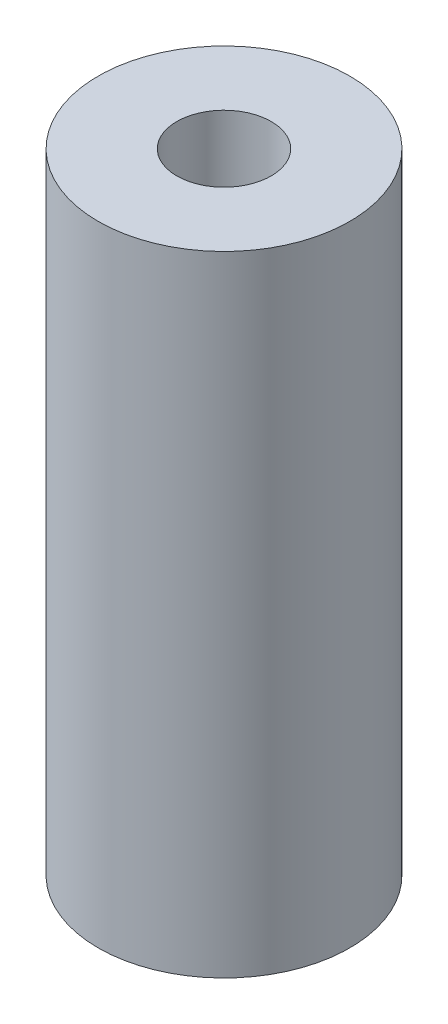
ISO-10303-21;
HEADER;
FILE_DESCRIPTION(('STEP AP214'),'2;1');
FILE_NAME('part.step','',(''),(''),'','','');
FILE_SCHEMA(('AUTOMOTIVE_DESIGN { 1 0 10303 214 1 1 1 1 }'));
ENDSEC;
DATA;
#1=APPLICATION_CONTEXT('core data for automotive mechanical design processes');
#2=APPLICATION_PROTOCOL_DEFINITION('international standard','automotive_design',2000,#1);
#3=PRODUCT_CONTEXT('',#1,'mechanical');
#4=PRODUCT('Part','Part','',(#3));
#5=PRODUCT_RELATED_PRODUCT_CATEGORY('part','',(#4));
#6=PRODUCT_DEFINITION_FORMATION('','',#4);
#7=PRODUCT_DEFINITION_CONTEXT('part definition',#1,'design');
#8=PRODUCT_DEFINITION('design','',#6,#7);
#9=PRODUCT_DEFINITION_SHAPE('','',#8);
#10=(LENGTH_UNIT() NAMED_UNIT(*) SI_UNIT(.MILLI.,.METRE.));
#11=(NAMED_UNIT(*) PLANE_ANGLE_UNIT() SI_UNIT($,.RADIAN.));
#12=(NAMED_UNIT(*) SI_UNIT($,.STERADIAN.) SOLID_ANGLE_UNIT());
#13=UNCERTAINTY_MEASURE_WITH_UNIT(LENGTH_MEASURE(1.E-05),#10,'distance_accuracy_value','');
#14=(GEOMETRIC_REPRESENTATION_CONTEXT(3) GLOBAL_UNCERTAINTY_ASSIGNED_CONTEXT((#13)) GLOBAL_UNIT_ASSIGNED_CONTEXT((#10,
#11,#12)) REPRESENTATION_CONTEXT('',''));
#15=CARTESIAN_POINT('',(0.,0.,0.));
#16=DIRECTION('',(0.,0.,1.));
#17=DIRECTION('',(1.,0.,0.));
#18=AXIS2_PLACEMENT_3D('',#15,#16,#17);
#19=CARTESIAN_POINT('',(0.,20.,0.));
#20=DIRECTION('',(0.,-1.,0.));
#21=DIRECTION('',(0.,0.,-1.));
#22=AXIS2_PLACEMENT_3D('',#19,#20,#21);
#23=CYLINDRICAL_SURFACE('',#22,4.);
#24=CARTESIAN_POINT('',(0.,20.,0.));
#25=DIRECTION('',(0.,1.,0.));
#26=DIRECTION('',(0.,0.,1.));
#27=AXIS2_PLACEMENT_3D('',#24,#25,#26);
#28=CIRCLE('',#27,4.);
#29=CARTESIAN_POINT('',(0.,20.,4.));
#30=VERTEX_POINT('',#29);
#31=EDGE_CURVE('E10',#30,#30,#28,.T.);
#32=ORIENTED_EDGE('',*,*,#31,.F.);
#33=EDGE_LOOP('',(#32));
#34=FACE_BOUND('',#33,.T.);
#35=CARTESIAN_POINT('',(0.,0.,0.));
#36=DIRECTION('',(0.,1.,0.));
#37=DIRECTION('',(0.,0.,1.));
#38=AXIS2_PLACEMENT_3D('',#35,#36,#37);
#39=CIRCLE('',#38,4.);
#40=CARTESIAN_POINT('',(0.,0.,4.));
#41=VERTEX_POINT('',#40);
#42=EDGE_CURVE('E46',#41,#41,#39,.T.);
#43=ORIENTED_EDGE('',*,*,#42,.T.);
#44=EDGE_LOOP('',(#43));
#45=FACE_BOUND('',#44,.T.);
#46=ADVANCED_FACE('F43',(#34,#45),#23,.T.);
#47=CARTESIAN_POINT('',(0.,20.,0.));
#48=DIRECTION('',(0.,1.,0.));
#49=DIRECTION('',(0.,0.,1.));
#50=AXIS2_PLACEMENT_3D('',#47,#48,#49);
#51=PLANE('',#50);
#52=CARTESIAN_POINT('',(0.,20.,0.));
#53=DIRECTION('',(0.,1.,0.));
#54=DIRECTION('',(0.,0.,1.));
#55=AXIS2_PLACEMENT_3D('',#52,#53,#54);
#56=CIRCLE('',#55,1.5);
#57=CARTESIAN_POINT('',(0.,20.,1.5));
#58=VERTEX_POINT('',#57);
#59=EDGE_CURVE('E57',#58,#58,#56,.T.);
#60=ORIENTED_EDGE('',*,*,#59,.F.);
#61=EDGE_LOOP('',(#60));
#62=FACE_BOUND('',#61,.T.);
#63=ORIENTED_EDGE('',*,*,#31,.T.);
#64=EDGE_LOOP('',(#63));
#65=FACE_BOUND('',#64,.T.);
#66=ADVANCED_FACE('F74',(#62,#65),#51,.T.);
#67=CARTESIAN_POINT('',(0.,0.,0.));
#68=DIRECTION('',(0.,1.,0.));
#69=DIRECTION('',(0.,0.,1.));
#70=AXIS2_PLACEMENT_3D('',#67,#68,#69);
#71=PLANE('',#70);
#72=ORIENTED_EDGE('',*,*,#42,.F.);
#73=EDGE_LOOP('',(#72));
#74=FACE_BOUND('',#73,.T.);
#75=ADVANCED_FACE('F70',(#74),#71,.F.);
#76=CARTESIAN_POINT('',(0.,5.,0.));
#77=DIRECTION('',(0.,1.,0.));
#78=DIRECTION('',(0.,0.,1.));
#79=AXIS2_PLACEMENT_3D('',#76,#77,#78);
#80=CYLINDRICAL_SURFACE('',#79,1.5);
#81=CARTESIAN_POINT('',(0.,5.,0.));
#82=DIRECTION('',(0.,1.,0.));
#83=DIRECTION('',(0.,0.,1.));
#84=AXIS2_PLACEMENT_3D('',#81,#82,#83);
#85=CIRCLE('',#84,1.5);
#86=CARTESIAN_POINT('',(0.,5.,1.5));
#87=VERTEX_POINT('',#86);
#88=EDGE_CURVE('E55',#87,#87,#85,.T.);
#89=ORIENTED_EDGE('',*,*,#88,.F.);
#90=EDGE_LOOP('',(#89));
#91=FACE_BOUND('',#90,.T.);
#92=ORIENTED_EDGE('',*,*,#59,.T.);
#93=EDGE_LOOP('',(#92));
#94=FACE_BOUND('',#93,.T.);
#95=ADVANCED_FACE('F67',(#91,#94),#80,.F.);
#96=CARTESIAN_POINT('',(0.,5.,0.));
#97=DIRECTION('',(0.,1.,0.));
#98=DIRECTION('',(0.,0.,1.));
#99=AXIS2_PLACEMENT_3D('',#96,#97,#98);
#100=PLANE('',#99);
#101=ORIENTED_EDGE('',*,*,#88,.T.);
#102=EDGE_LOOP('',(#101));
#103=FACE_BOUND('',#102,.T.);
#104=ADVANCED_FACE('F65',(#103),#100,.T.);
#105=CLOSED_SHELL('',(#46,#66,#75,#95,#104));
#106=MANIFOLD_SOLID_BREP('B2',#105);
#107=ADVANCED_BREP_SHAPE_REPRESENTATION('',(#18,#106),#14);
#108=SHAPE_DEFINITION_REPRESENTATION(#9,#107);
ENDSEC;
END-ISO-10303-21;
